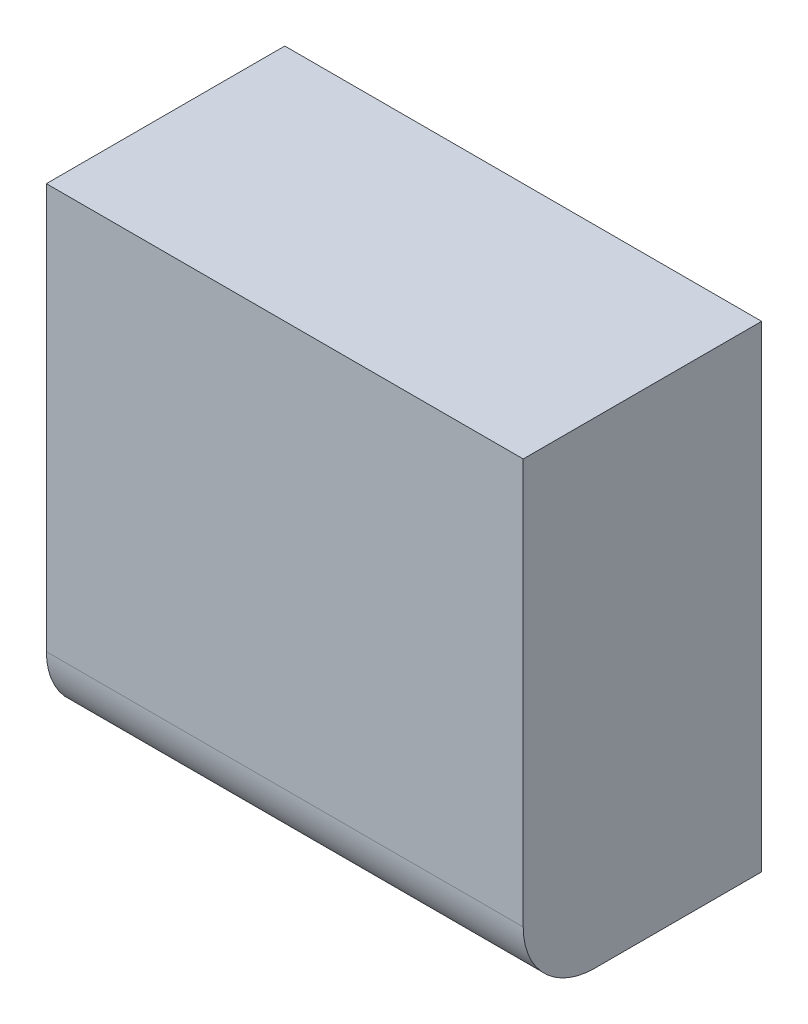
ISO-10303-21;
HEADER;
FILE_DESCRIPTION(('STEP AP214'),'2;1');
FILE_NAME('part.step','',(''),(''),'','','');
FILE_SCHEMA(('AUTOMOTIVE_DESIGN { 1 0 10303 214 1 1 1 1 }'));
ENDSEC;
DATA;
#1=APPLICATION_CONTEXT('core data for automotive mechanical design processes');
#2=APPLICATION_PROTOCOL_DEFINITION('international standard','automotive_design',2000,#1);
#3=PRODUCT_CONTEXT('',#1,'mechanical');
#4=PRODUCT('Part','Part','',(#3));
#5=PRODUCT_RELATED_PRODUCT_CATEGORY('part','',(#4));
#6=PRODUCT_DEFINITION_FORMATION('','',#4);
#7=PRODUCT_DEFINITION_CONTEXT('part definition',#1,'design');
#8=PRODUCT_DEFINITION('design','',#6,#7);
#9=PRODUCT_DEFINITION_SHAPE('','',#8);
#10=(LENGTH_UNIT() NAMED_UNIT(*) SI_UNIT(.MILLI.,.METRE.));
#11=(NAMED_UNIT(*) PLANE_ANGLE_UNIT() SI_UNIT($,.RADIAN.));
#12=(NAMED_UNIT(*) SI_UNIT($,.STERADIAN.) SOLID_ANGLE_UNIT());
#13=UNCERTAINTY_MEASURE_WITH_UNIT(LENGTH_MEASURE(1.E-05),#10,'distance_accuracy_value','');
#14=(GEOMETRIC_REPRESENTATION_CONTEXT(3) GLOBAL_UNCERTAINTY_ASSIGNED_CONTEXT((#13)) GLOBAL_UNIT_ASSIGNED_CONTEXT((#10,
#11,#12)) REPRESENTATION_CONTEXT('',''));
#15=CARTESIAN_POINT('',(0.,0.,0.));
#16=DIRECTION('',(0.,0.,1.));
#17=DIRECTION('',(1.,0.,0.));
#18=AXIS2_PLACEMENT_3D('',#15,#16,#17);
#19=CARTESIAN_POINT('',(0.,0.,10.));
#20=DIRECTION('',(1.,0.,0.));
#21=DIRECTION('',(0.,0.,-1.));
#22=AXIS2_PLACEMENT_3D('',#19,#20,#21);
#23=PLANE('',#22);
#24=DIRECTION('',(0.,0.,-1.));
#25=VECTOR('',#24,1.);
#26=CARTESIAN_POINT('',(0.,0.,10.));
#27=LINE('',#26,#25);
#28=CARTESIAN_POINT('',(0.,0.,7.));
#29=VERTEX_POINT('',#28);
#30=CARTESIAN_POINT('',(0.,0.,0.));
#31=VERTEX_POINT('',#30);
#32=EDGE_CURVE('E117',#29,#31,#27,.T.);
#33=ORIENTED_EDGE('',*,*,#32,.F.);
#34=CARTESIAN_POINT('',(0.,3.,7.));
#35=DIRECTION('',(1.,0.,0.));
#36=DIRECTION('',(0.,0.,-1.));
#37=AXIS2_PLACEMENT_3D('',#34,#35,#36);
#38=CIRCLE('',#37,3.);
#39=CARTESIAN_POINT('',(0.,3.,10.));
#40=VERTEX_POINT('',#39);
#41=EDGE_CURVE('E11',#29,#40,#38,.F.);
#42=ORIENTED_EDGE('',*,*,#41,.T.);
#43=DIRECTION('',(0.,-1.,0.));
#44=VECTOR('',#43,1.);
#45=CARTESIAN_POINT('',(0.,0.,10.));
#46=LINE('',#45,#44);
#47=CARTESIAN_POINT('',(0.,20.,10.));
#48=VERTEX_POINT('',#47);
#49=EDGE_CURVE('E88',#48,#40,#46,.T.);
#50=ORIENTED_EDGE('',*,*,#49,.F.);
#51=DIRECTION('',(0.,0.,-1.));
#52=VECTOR('',#51,1.);
#53=CARTESIAN_POINT('',(0.,20.,10.));
#54=LINE('',#53,#52);
#55=CARTESIAN_POINT('',(0.,20.,0.));
#56=VERTEX_POINT('',#55);
#57=EDGE_CURVE('E98',#48,#56,#54,.T.);
#58=ORIENTED_EDGE('',*,*,#57,.T.);
#59=DIRECTION('',(0.,-1.,0.));
#60=VECTOR('',#59,1.);
#61=CARTESIAN_POINT('',(0.,0.,0.));
#62=LINE('',#61,#60);
#63=EDGE_CURVE('E107',#56,#31,#62,.T.);
#64=ORIENTED_EDGE('',*,*,#63,.T.);
#65=EDGE_LOOP('',(#33,#42,#50,#58,#64));
#66=FACE_BOUND('',#65,.T.);
#67=ADVANCED_FACE('F35',(#66),#23,.F.);
#68=CARTESIAN_POINT('',(0.,0.,10.));
#69=DIRECTION('',(0.,1.,0.));
#70=DIRECTION('',(0.,0.,1.));
#71=AXIS2_PLACEMENT_3D('',#68,#69,#70);
#72=PLANE('',#71);
#73=DIRECTION('',(0.,0.,-1.));
#74=VECTOR('',#73,1.);
#75=CARTESIAN_POINT('',(20.,0.,10.));
#76=LINE('',#75,#74);
#77=CARTESIAN_POINT('',(20.,0.,7.));
#78=VERTEX_POINT('',#77);
#79=CARTESIAN_POINT('',(20.,0.,0.));
#80=VERTEX_POINT('',#79);
#81=EDGE_CURVE('E97',#78,#80,#76,.T.);
#82=ORIENTED_EDGE('',*,*,#81,.F.);
#83=DIRECTION('',(1.,0.,0.));
#84=VECTOR('',#83,1.);
#85=CARTESIAN_POINT('',(0.,0.,7.));
#86=LINE('',#85,#84);
#87=EDGE_CURVE('E43',#78,#29,#86,.F.);
#88=ORIENTED_EDGE('',*,*,#87,.T.);
#89=ORIENTED_EDGE('',*,*,#32,.T.);
#90=DIRECTION('',(1.,0.,0.));
#91=VECTOR('',#90,1.);
#92=CARTESIAN_POINT('',(0.,0.,0.));
#93=LINE('',#92,#91);
#94=EDGE_CURVE('E110',#31,#80,#93,.T.);
#95=ORIENTED_EDGE('',*,*,#94,.T.);
#96=EDGE_LOOP('',(#82,#88,#89,#95));
#97=FACE_BOUND('',#96,.T.);
#98=ADVANCED_FACE('F121',(#97),#72,.F.);
#99=CARTESIAN_POINT('',(20.,0.,10.));
#100=DIRECTION('',(-1.,0.,0.));
#101=DIRECTION('',(0.,0.,1.));
#102=AXIS2_PLACEMENT_3D('',#99,#100,#101);
#103=PLANE('',#102);
#104=DIRECTION('',(0.,1.,0.));
#105=VECTOR('',#104,1.);
#106=CARTESIAN_POINT('',(20.,0.,10.));
#107=LINE('',#106,#105);
#108=CARTESIAN_POINT('',(20.,3.,10.));
#109=VERTEX_POINT('',#108);
#110=CARTESIAN_POINT('',(20.,20.,10.));
#111=VERTEX_POINT('',#110);
#112=EDGE_CURVE('E79',#109,#111,#107,.T.);
#113=ORIENTED_EDGE('',*,*,#112,.F.);
#114=CARTESIAN_POINT('',(20.,3.,7.));
#115=DIRECTION('',(-1.,0.,0.));
#116=DIRECTION('',(0.,0.,1.));
#117=AXIS2_PLACEMENT_3D('',#114,#115,#116);
#118=CIRCLE('',#117,3.);
#119=EDGE_CURVE('E57',#109,#78,#118,.F.);
#120=ORIENTED_EDGE('',*,*,#119,.T.);
#121=ORIENTED_EDGE('',*,*,#81,.T.);
#122=DIRECTION('',(0.,1.,0.));
#123=VECTOR('',#122,1.);
#124=CARTESIAN_POINT('',(20.,0.,0.));
#125=LINE('',#124,#123);
#126=CARTESIAN_POINT('',(20.,20.,0.));
#127=VERTEX_POINT('',#126);
#128=EDGE_CURVE('E94',#80,#127,#125,.T.);
#129=ORIENTED_EDGE('',*,*,#128,.T.);
#130=DIRECTION('',(0.,0.,-1.));
#131=VECTOR('',#130,1.);
#132=CARTESIAN_POINT('',(20.,20.,10.));
#133=LINE('',#132,#131);
#134=EDGE_CURVE('E91',#111,#127,#133,.T.);
#135=ORIENTED_EDGE('',*,*,#134,.F.);
#136=EDGE_LOOP('',(#113,#120,#121,#129,#135));
#137=FACE_BOUND('',#136,.T.);
#138=ADVANCED_FACE('F92',(#137),#103,.F.);
#139=CARTESIAN_POINT('',(0.,20.,10.));
#140=DIRECTION('',(0.,-1.,0.));
#141=DIRECTION('',(0.,0.,-1.));
#142=AXIS2_PLACEMENT_3D('',#139,#140,#141);
#143=PLANE('',#142);
#144=DIRECTION('',(-1.,0.,0.));
#145=VECTOR('',#144,1.);
#146=CARTESIAN_POINT('',(0.,20.,0.));
#147=LINE('',#146,#145);
#148=EDGE_CURVE('E114',#127,#56,#147,.T.);
#149=ORIENTED_EDGE('',*,*,#148,.T.);
#150=ORIENTED_EDGE('',*,*,#57,.F.);
#151=DIRECTION('',(-1.,0.,0.));
#152=VECTOR('',#151,1.);
#153=CARTESIAN_POINT('',(0.,20.,10.));
#154=LINE('',#153,#152);
#155=EDGE_CURVE('E84',#111,#48,#154,.T.);
#156=ORIENTED_EDGE('',*,*,#155,.F.);
#157=ORIENTED_EDGE('',*,*,#134,.T.);
#158=EDGE_LOOP('',(#149,#150,#156,#157));
#159=FACE_BOUND('',#158,.T.);
#160=ADVANCED_FACE('F100',(#159),#143,.F.);
#161=CARTESIAN_POINT('',(0.,0.,10.));
#162=DIRECTION('',(0.,0.,-1.));
#163=DIRECTION('',(-1.,0.,0.));
#164=AXIS2_PLACEMENT_3D('',#161,#162,#163);
#165=PLANE('',#164);
#166=ORIENTED_EDGE('',*,*,#49,.T.);
#167=DIRECTION('',(1.,0.,0.));
#168=VECTOR('',#167,1.);
#169=CARTESIAN_POINT('',(0.,3.,10.));
#170=LINE('',#169,#168);
#171=EDGE_CURVE('E87',#40,#109,#170,.T.);
#172=ORIENTED_EDGE('',*,*,#171,.T.);
#173=ORIENTED_EDGE('',*,*,#112,.T.);
#174=ORIENTED_EDGE('',*,*,#155,.T.);
#175=EDGE_LOOP('',(#166,#172,#173,#174));
#176=FACE_BOUND('',#175,.T.);
#177=ADVANCED_FACE('F82',(#176),#165,.F.);
#178=CARTESIAN_POINT('',(0.,0.,0.));
#179=DIRECTION('',(0.,0.,-1.));
#180=DIRECTION('',(-1.,0.,0.));
#181=AXIS2_PLACEMENT_3D('',#178,#179,#180);
#182=PLANE('',#181);
#183=ORIENTED_EDGE('',*,*,#63,.F.);
#184=ORIENTED_EDGE('',*,*,#148,.F.);
#185=ORIENTED_EDGE('',*,*,#128,.F.);
#186=ORIENTED_EDGE('',*,*,#94,.F.);
#187=EDGE_LOOP('',(#183,#184,#185,#186));
#188=FACE_BOUND('',#187,.T.);
#189=ADVANCED_FACE('F126',(#188),#182,.T.);
#190=CARTESIAN_POINT('',(0.,3.,7.));
#191=DIRECTION('',(1.,0.,0.));
#192=DIRECTION('',(0.,0.,-1.));
#193=AXIS2_PLACEMENT_3D('',#190,#191,#192);
#194=CYLINDRICAL_SURFACE('',#193,3.);
#195=ORIENTED_EDGE('',*,*,#41,.F.);
#196=ORIENTED_EDGE('',*,*,#87,.F.);
#197=ORIENTED_EDGE('',*,*,#119,.F.);
#198=ORIENTED_EDGE('',*,*,#171,.F.);
#199=EDGE_LOOP('',(#195,#196,#197,#198));
#200=FACE_BOUND('',#199,.T.);
#201=ADVANCED_FACE('F37',(#200),#194,.T.);
#202=CLOSED_SHELL('',(#67,#98,#138,#160,#177,#189,#201));
#203=MANIFOLD_SOLID_BREP('B2',#202);
#204=ADVANCED_BREP_SHAPE_REPRESENTATION('',(#18,#203),#14);
#205=SHAPE_DEFINITION_REPRESENTATION(#9,#204);
ENDSEC;
END-ISO-10303-21;
